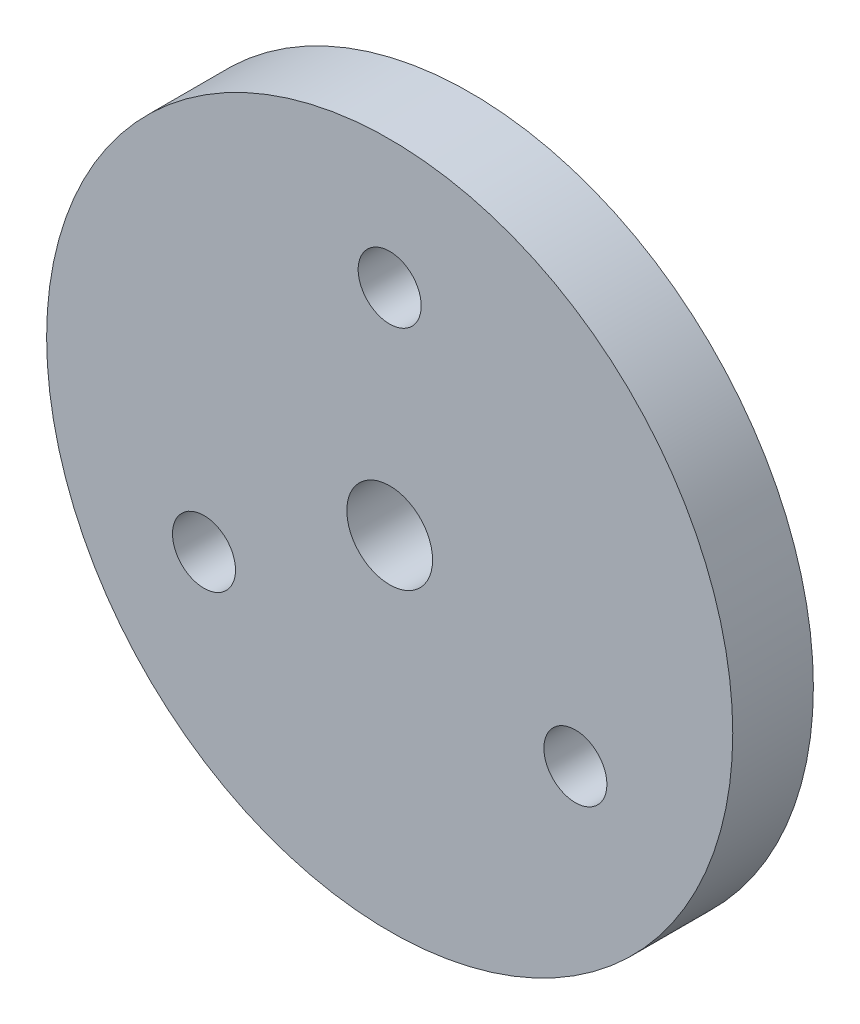
ISO-10303-21;
HEADER;
FILE_DESCRIPTION(('STEP AP214'),'2;1');
FILE_NAME('part.step','',(''),(''),'','','');
FILE_SCHEMA(('AUTOMOTIVE_DESIGN { 1 0 10303 214 1 1 1 1 }'));
ENDSEC;
DATA;
#1=APPLICATION_CONTEXT('core data for automotive mechanical design processes');
#2=APPLICATION_PROTOCOL_DEFINITION('international standard','automotive_design',2000,#1);
#3=PRODUCT_CONTEXT('',#1,'mechanical');
#4=PRODUCT('Part','Part','',(#3));
#5=PRODUCT_RELATED_PRODUCT_CATEGORY('part','',(#4));
#6=PRODUCT_DEFINITION_FORMATION('','',#4);
#7=PRODUCT_DEFINITION_CONTEXT('part definition',#1,'design');
#8=PRODUCT_DEFINITION('design','',#6,#7);
#9=PRODUCT_DEFINITION_SHAPE('','',#8);
#10=(LENGTH_UNIT() NAMED_UNIT(*) SI_UNIT(.MILLI.,.METRE.));
#11=(NAMED_UNIT(*) PLANE_ANGLE_UNIT() SI_UNIT($,.RADIAN.));
#12=(NAMED_UNIT(*) SI_UNIT($,.STERADIAN.) SOLID_ANGLE_UNIT());
#13=UNCERTAINTY_MEASURE_WITH_UNIT(LENGTH_MEASURE(1.E-05),#10,'distance_accuracy_value','');
#14=(GEOMETRIC_REPRESENTATION_CONTEXT(3) GLOBAL_UNCERTAINTY_ASSIGNED_CONTEXT((#13)) GLOBAL_UNIT_ASSIGNED_CONTEXT((#10,
#11,#12)) REPRESENTATION_CONTEXT('',''));
#15=CARTESIAN_POINT('',(0.,0.,0.));
#16=DIRECTION('',(0.,0.,1.));
#17=DIRECTION('',(1.,0.,0.));
#18=AXIS2_PLACEMENT_3D('',#15,#16,#17);
#19=CARTESIAN_POINT('',(0.,0.,11.938));
#20=DIRECTION('',(0.,0.,-1.));
#21=DIRECTION('',(-1.,0.,0.));
#22=AXIS2_PLACEMENT_3D('',#19,#20,#21);
#23=CYLINDRICAL_SURFACE('',#22,50.8);
#24=CARTESIAN_POINT('',(0.,0.,11.938));
#25=DIRECTION('',(0.,0.,1.));
#26=DIRECTION('',(1.,0.,0.));
#27=AXIS2_PLACEMENT_3D('',#24,#25,#26);
#28=CIRCLE('',#27,50.8);
#29=CARTESIAN_POINT('',(50.8,0.,11.938));
#30=VERTEX_POINT('',#29);
#31=EDGE_CURVE('E10',#30,#30,#28,.T.);
#32=ORIENTED_EDGE('',*,*,#31,.F.);
#33=EDGE_LOOP('',(#32));
#34=FACE_BOUND('',#33,.T.);
#35=CARTESIAN_POINT('',(0.,0.,0.));
#36=DIRECTION('',(0.,0.,1.));
#37=DIRECTION('',(1.,0.,0.));
#38=AXIS2_PLACEMENT_3D('',#35,#36,#37);
#39=CIRCLE('',#38,50.8);
#40=CARTESIAN_POINT('',(50.8,0.,0.));
#41=VERTEX_POINT('',#40);
#42=EDGE_CURVE('E33',#41,#41,#39,.T.);
#43=ORIENTED_EDGE('',*,*,#42,.T.);
#44=EDGE_LOOP('',(#43));
#45=FACE_BOUND('',#44,.T.);
#46=ADVANCED_FACE('F30',(#34,#45),#23,.T.);
#47=CARTESIAN_POINT('',(0.,0.,11.938));
#48=DIRECTION('',(0.,0.,1.));
#49=DIRECTION('',(1.,0.,0.));
#50=AXIS2_PLACEMENT_3D('',#47,#48,#49);
#51=PLANE('',#50);
#52=CARTESIAN_POINT('',(-27.4963065701561,-15.8749999999997,11.938));
#53=DIRECTION('',(0.,0.,1.));
#54=DIRECTION('',(-0.499999999999992,0.866025403784443,0.));
#55=AXIS2_PLACEMENT_3D('',#52,#53,#54);
#56=CIRCLE('',#55,4.66627796000196);
#57=CARTESIAN_POINT('',(-29.829445550157,-11.8338847455186,11.938));
#58=VERTEX_POINT('',#57);
#59=EDGE_CURVE('E60',#58,#58,#56,.T.);
#60=ORIENTED_EDGE('',*,*,#59,.F.);
#61=EDGE_LOOP('',(#60));
#62=FACE_BOUND('',#61,.T.);
#63=CARTESIAN_POINT('',(27.4963065701559,-15.8750000000001,11.938));
#64=DIRECTION('',(0.,0.,1.));
#65=DIRECTION('',(-0.500000000000004,-0.866025403784436,0.));
#66=AXIS2_PLACEMENT_3D('',#63,#64,#65);
#67=CIRCLE('',#66,4.66627796000196);
#68=CARTESIAN_POINT('',(25.1631675901549,-19.9161152544812,11.938));
#69=VERTEX_POINT('',#68);
#70=EDGE_CURVE('E54',#69,#69,#67,.T.);
#71=ORIENTED_EDGE('',*,*,#70,.F.);
#72=EDGE_LOOP('',(#71));
#73=FACE_BOUND('',#72,.T.);
#74=CARTESIAN_POINT('',(0.,31.75,11.938));
#75=DIRECTION('',(0.,0.,1.));
#76=DIRECTION('',(1.,0.,0.));
#77=AXIS2_PLACEMENT_3D('',#74,#75,#76);
#78=CIRCLE('',#77,4.66627796000196);
#79=CARTESIAN_POINT('',(4.66627796000196,31.75,11.938));
#80=VERTEX_POINT('',#79);
#81=EDGE_CURVE('E48',#80,#80,#78,.T.);
#82=ORIENTED_EDGE('',*,*,#81,.F.);
#83=EDGE_LOOP('',(#82));
#84=FACE_BOUND('',#83,.T.);
#85=CARTESIAN_POINT('',(0.,0.,11.938));
#86=DIRECTION('',(0.,0.,1.));
#87=DIRECTION('',(1.,0.,0.));
#88=AXIS2_PLACEMENT_3D('',#85,#86,#87);
#89=CIRCLE('',#88,6.35);
#90=CARTESIAN_POINT('',(6.35,0.,11.938));
#91=VERTEX_POINT('',#90);
#92=EDGE_CURVE('E42',#91,#91,#89,.T.);
#93=ORIENTED_EDGE('',*,*,#92,.F.);
#94=EDGE_LOOP('',(#93));
#95=FACE_BOUND('',#94,.T.);
#96=ORIENTED_EDGE('',*,*,#31,.T.);
#97=EDGE_LOOP('',(#96));
#98=FACE_BOUND('',#97,.T.);
#99=ADVANCED_FACE('F76',(#62,#73,#84,#95,#98),#51,.T.);
#100=CARTESIAN_POINT('',(0.,0.,0.));
#101=DIRECTION('',(0.,0.,1.));
#102=DIRECTION('',(1.,0.,0.));
#103=AXIS2_PLACEMENT_3D('',#100,#101,#102);
#104=PLANE('',#103);
#105=CARTESIAN_POINT('',(-27.4963065701561,-15.8749999999997,0.));
#106=DIRECTION('',(0.,0.,1.));
#107=DIRECTION('',(-0.499999999999992,0.866025403784443,0.));
#108=AXIS2_PLACEMENT_3D('',#105,#106,#107);
#109=CIRCLE('',#108,4.66627796000196);
#110=CARTESIAN_POINT('',(-29.829445550157,-11.8338847455186,0.));
#111=VERTEX_POINT('',#110);
#112=EDGE_CURVE('E57',#111,#111,#109,.T.);
#113=ORIENTED_EDGE('',*,*,#112,.T.);
#114=EDGE_LOOP('',(#113));
#115=FACE_BOUND('',#114,.T.);
#116=CARTESIAN_POINT('',(27.4963065701559,-15.8750000000001,0.));
#117=DIRECTION('',(0.,0.,1.));
#118=DIRECTION('',(-0.500000000000004,-0.866025403784436,0.));
#119=AXIS2_PLACEMENT_3D('',#116,#117,#118);
#120=CIRCLE('',#119,4.66627796000196);
#121=CARTESIAN_POINT('',(25.1631675901549,-19.9161152544812,0.));
#122=VERTEX_POINT('',#121);
#123=EDGE_CURVE('E51',#122,#122,#120,.T.);
#124=ORIENTED_EDGE('',*,*,#123,.T.);
#125=EDGE_LOOP('',(#124));
#126=FACE_BOUND('',#125,.T.);
#127=CARTESIAN_POINT('',(0.,31.75,0.));
#128=DIRECTION('',(0.,0.,1.));
#129=DIRECTION('',(1.,0.,0.));
#130=AXIS2_PLACEMENT_3D('',#127,#128,#129);
#131=CIRCLE('',#130,4.66627796000196);
#132=CARTESIAN_POINT('',(4.66627796000196,31.75,0.));
#133=VERTEX_POINT('',#132);
#134=EDGE_CURVE('E45',#133,#133,#131,.T.);
#135=ORIENTED_EDGE('',*,*,#134,.T.);
#136=EDGE_LOOP('',(#135));
#137=FACE_BOUND('',#136,.T.);
#138=CARTESIAN_POINT('',(0.,0.,0.));
#139=DIRECTION('',(0.,0.,1.));
#140=DIRECTION('',(1.,0.,0.));
#141=AXIS2_PLACEMENT_3D('',#138,#139,#140);
#142=CIRCLE('',#141,6.35);
#143=CARTESIAN_POINT('',(6.35,0.,0.));
#144=VERTEX_POINT('',#143);
#145=EDGE_CURVE('E40',#144,#144,#142,.T.);
#146=ORIENTED_EDGE('',*,*,#145,.T.);
#147=EDGE_LOOP('',(#146));
#148=FACE_BOUND('',#147,.T.);
#149=ORIENTED_EDGE('',*,*,#42,.F.);
#150=EDGE_LOOP('',(#149));
#151=FACE_BOUND('',#150,.T.);
#152=ADVANCED_FACE('F66',(#115,#126,#137,#148,#151),#104,.F.);
#153=CARTESIAN_POINT('',(0.,0.,0.));
#154=DIRECTION('',(0.,0.,1.));
#155=DIRECTION('',(1.,0.,0.));
#156=AXIS2_PLACEMENT_3D('',#153,#154,#155);
#157=CYLINDRICAL_SURFACE('',#156,6.35);
#158=ORIENTED_EDGE('',*,*,#145,.F.);
#159=EDGE_LOOP('',(#158));
#160=FACE_BOUND('',#159,.T.);
#161=ORIENTED_EDGE('',*,*,#92,.T.);
#162=EDGE_LOOP('',(#161));
#163=FACE_BOUND('',#162,.T.);
#164=ADVANCED_FACE('F86',(#160,#163),#157,.F.);
#165=CARTESIAN_POINT('',(0.,31.75,0.));
#166=DIRECTION('',(0.,0.,1.));
#167=DIRECTION('',(1.,0.,0.));
#168=AXIS2_PLACEMENT_3D('',#165,#166,#167);
#169=CYLINDRICAL_SURFACE('',#168,4.66627796000196);
#170=ORIENTED_EDGE('',*,*,#134,.F.);
#171=EDGE_LOOP('',(#170));
#172=FACE_BOUND('',#171,.T.);
#173=ORIENTED_EDGE('',*,*,#81,.T.);
#174=EDGE_LOOP('',(#173));
#175=FACE_BOUND('',#174,.T.);
#176=ADVANCED_FACE('F88',(#172,#175),#169,.F.);
#177=CARTESIAN_POINT('',(27.4963065701559,-15.8750000000001,0.));
#178=DIRECTION('',(0.,0.,1.));
#179=DIRECTION('',(1.,0.,0.));
#180=AXIS2_PLACEMENT_3D('',#177,#178,#179);
#181=CYLINDRICAL_SURFACE('',#180,4.66627796000196);
#182=ORIENTED_EDGE('',*,*,#123,.F.);
#183=EDGE_LOOP('',(#182));
#184=FACE_BOUND('',#183,.T.);
#185=ORIENTED_EDGE('',*,*,#70,.T.);
#186=EDGE_LOOP('',(#185));
#187=FACE_BOUND('',#186,.T.);
#188=ADVANCED_FACE('F72',(#184,#187),#181,.F.);
#189=CARTESIAN_POINT('',(-27.4963065701561,-15.8749999999997,0.));
#190=DIRECTION('',(0.,0.,1.));
#191=DIRECTION('',(1.,0.,0.));
#192=AXIS2_PLACEMENT_3D('',#189,#190,#191);
#193=CYLINDRICAL_SURFACE('',#192,4.66627796000196);
#194=ORIENTED_EDGE('',*,*,#112,.F.);
#195=EDGE_LOOP('',(#194));
#196=FACE_BOUND('',#195,.T.);
#197=ORIENTED_EDGE('',*,*,#59,.T.);
#198=EDGE_LOOP('',(#197));
#199=FACE_BOUND('',#198,.T.);
#200=ADVANCED_FACE('F69',(#196,#199),#193,.F.);
#201=CLOSED_SHELL('',(#46,#99,#152,#164,#176,#188,#200));
#202=MANIFOLD_SOLID_BREP('B2',#201);
#203=ADVANCED_BREP_SHAPE_REPRESENTATION('',(#18,#202),#14);
#204=SHAPE_DEFINITION_REPRESENTATION(#9,#203);
ENDSEC;
END-ISO-10303-21;
